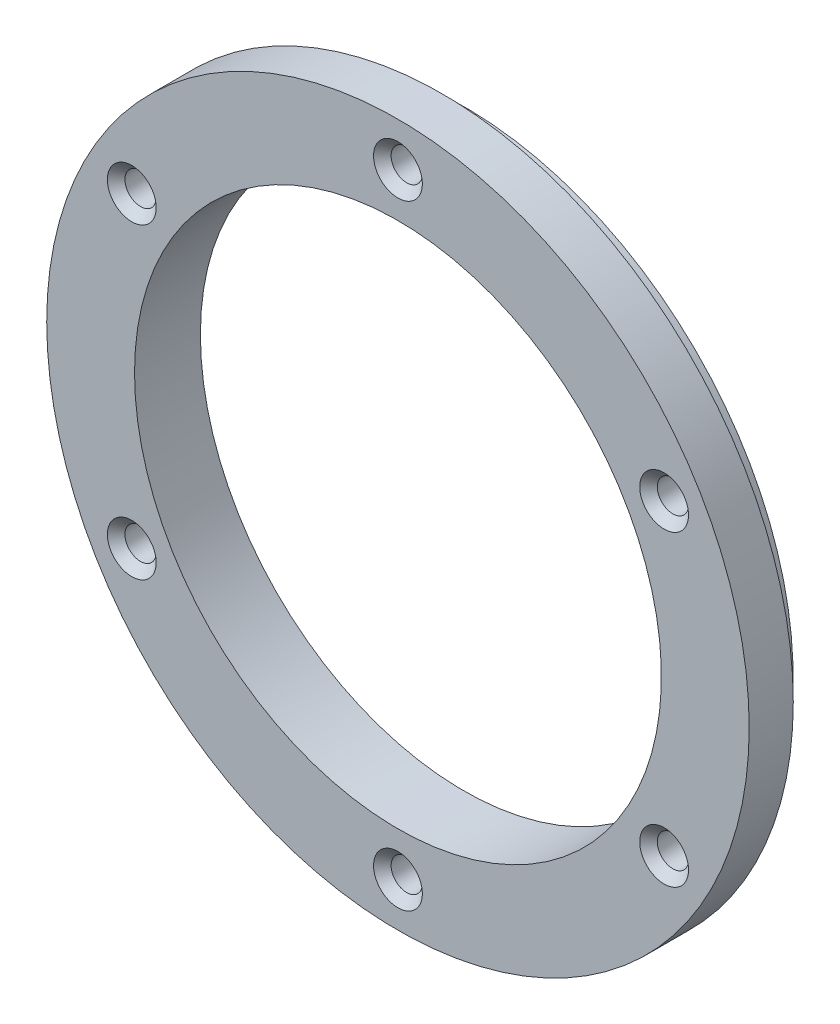
ISO-10303-21;
HEADER;
FILE_DESCRIPTION(('STEP AP214'),'2;1');
FILE_NAME('part.step','',(''),(''),'','','');
FILE_SCHEMA(('AUTOMOTIVE_DESIGN { 1 0 10303 214 1 1 1 1 }'));
ENDSEC;
DATA;
#1=APPLICATION_CONTEXT('core data for automotive mechanical design processes');
#2=APPLICATION_PROTOCOL_DEFINITION('international standard','automotive_design',2000,#1);
#3=PRODUCT_CONTEXT('',#1,'mechanical');
#4=PRODUCT('Part','Part','',(#3));
#5=PRODUCT_RELATED_PRODUCT_CATEGORY('part','',(#4));
#6=PRODUCT_DEFINITION_FORMATION('','',#4);
#7=PRODUCT_DEFINITION_CONTEXT('part definition',#1,'design');
#8=PRODUCT_DEFINITION('design','',#6,#7);
#9=PRODUCT_DEFINITION_SHAPE('','',#8);
#10=(LENGTH_UNIT() NAMED_UNIT(*) SI_UNIT(.MILLI.,.METRE.));
#11=(NAMED_UNIT(*) PLANE_ANGLE_UNIT() SI_UNIT($,.RADIAN.));
#12=(NAMED_UNIT(*) SI_UNIT($,.STERADIAN.) SOLID_ANGLE_UNIT());
#13=UNCERTAINTY_MEASURE_WITH_UNIT(LENGTH_MEASURE(1.E-05),#10,'distance_accuracy_value','');
#14=(GEOMETRIC_REPRESENTATION_CONTEXT(3) GLOBAL_UNCERTAINTY_ASSIGNED_CONTEXT((#13)) GLOBAL_UNIT_ASSIGNED_CONTEXT((#10,
#11,#12)) REPRESENTATION_CONTEXT('',''));
#15=CARTESIAN_POINT('',(0.,0.,0.));
#16=DIRECTION('',(0.,0.,1.));
#17=DIRECTION('',(1.,0.,0.));
#18=AXIS2_PLACEMENT_3D('',#15,#16,#17);
#19=CARTESIAN_POINT('',(0.,0.,0.));
#20=DIRECTION('',(0.,0.,1.));
#21=DIRECTION('',(1.,0.,0.));
#22=AXIS2_PLACEMENT_3D('',#19,#20,#21);
#23=PLANE('',#22);
#24=CARTESIAN_POINT('',(0.,0.,0.));
#25=DIRECTION('',(0.,0.,1.));
#26=DIRECTION('',(1.,0.,0.));
#27=AXIS2_PLACEMENT_3D('',#24,#25,#26);
#28=CIRCLE('',#27,19.05);
#29=CARTESIAN_POINT('',(-19.05,0.,0.));
#30=VERTEX_POINT('',#29);
#31=EDGE_CURVE('E48',#30,#30,#28,.T.);
#32=ORIENTED_EDGE('',*,*,#31,.T.);
#33=EDGE_LOOP('',(#32));
#34=FACE_BOUND('',#33,.T.);
#35=CARTESIAN_POINT('',(-19.247414599109,11.1125000000002,0.));
#36=DIRECTION('',(0.,0.,1.));
#37=DIRECTION('',(1.,0.,0.));
#38=AXIS2_PLACEMENT_3D('',#35,#36,#37);
#39=CIRCLE('',#38,1.13029999999999);
#40=CARTESIAN_POINT('',(-18.117114599109,11.1125000000002,0.));
#41=VERTEX_POINT('',#40);
#42=EDGE_CURVE('E52',#41,#41,#39,.T.);
#43=ORIENTED_EDGE('',*,*,#42,.T.);
#44=EDGE_LOOP('',(#43));
#45=FACE_BOUND('',#44,.T.);
#46=CARTESIAN_POINT('',(-19.2474145991087,-11.1125000000003,0.));
#47=DIRECTION('',(0.,0.,1.));
#48=DIRECTION('',(1.,0.,0.));
#49=AXIS2_PLACEMENT_3D('',#46,#47,#48);
#50=CIRCLE('',#49,1.13029999999999);
#51=CARTESIAN_POINT('',(-18.1171145991087,-11.1125000000003,0.));
#52=VERTEX_POINT('',#51);
#53=EDGE_CURVE('E56',#52,#52,#50,.T.);
#54=ORIENTED_EDGE('',*,*,#53,.T.);
#55=EDGE_LOOP('',(#54));
#56=FACE_BOUND('',#55,.T.);
#57=CARTESIAN_POINT('',(6.30260256199605E-13,-22.225,0.));
#58=DIRECTION('',(0.,0.,1.));
#59=DIRECTION('',(1.,0.,0.));
#60=AXIS2_PLACEMENT_3D('',#57,#58,#59);
#61=CIRCLE('',#60,1.13029999999999);
#62=CARTESIAN_POINT('',(1.13030000000062,-22.225,0.));
#63=VERTEX_POINT('',#62);
#64=EDGE_CURVE('E61',#63,#63,#61,.T.);
#65=ORIENTED_EDGE('',*,*,#64,.T.);
#66=EDGE_LOOP('',(#65));
#67=FACE_BOUND('',#66,.T.);
#68=CARTESIAN_POINT('',(19.2474145991096,-11.1124999999997,0.));
#69=DIRECTION('',(0.,0.,1.));
#70=DIRECTION('',(1.,0.,0.));
#71=AXIS2_PLACEMENT_3D('',#68,#69,#70);
#72=CIRCLE('',#71,1.13029999999999);
#73=CARTESIAN_POINT('',(20.3777145991096,-11.1124999999997,0.));
#74=VERTEX_POINT('',#73);
#75=EDGE_CURVE('E66',#74,#74,#72,.T.);
#76=ORIENTED_EDGE('',*,*,#75,.T.);
#77=EDGE_LOOP('',(#76));
#78=FACE_BOUND('',#77,.T.);
#79=CARTESIAN_POINT('',(19.2474145991092,11.1125,0.));
#80=DIRECTION('',(0.,0.,1.));
#81=DIRECTION('',(1.,0.,0.));
#82=AXIS2_PLACEMENT_3D('',#79,#80,#81);
#83=CIRCLE('',#82,1.13029999999999);
#84=CARTESIAN_POINT('',(20.3777145991092,11.1125,0.));
#85=VERTEX_POINT('',#84);
#86=EDGE_CURVE('E71',#85,#85,#83,.T.);
#87=ORIENTED_EDGE('',*,*,#86,.T.);
#88=EDGE_LOOP('',(#87));
#89=FACE_BOUND('',#88,.T.);
#90=CARTESIAN_POINT('',(0.,22.225,0.));
#91=DIRECTION('',(0.,0.,1.));
#92=DIRECTION('',(1.,0.,0.));
#93=AXIS2_PLACEMENT_3D('',#90,#91,#92);
#94=CIRCLE('',#93,1.13029999999999);
#95=CARTESIAN_POINT('',(1.13029999999999,22.225,0.));
#96=VERTEX_POINT('',#95);
#97=EDGE_CURVE('E75',#96,#96,#94,.T.);
#98=ORIENTED_EDGE('',*,*,#97,.T.);
#99=EDGE_LOOP('',(#98));
#100=FACE_BOUND('',#99,.T.);
#101=CARTESIAN_POINT('',(0.,0.,0.));
#102=DIRECTION('',(0.,0.,-1.));
#103=DIRECTION('',(-1.,0.,0.));
#104=AXIS2_PLACEMENT_3D('',#101,#102,#103);
#105=CIRCLE('',#104,23.8125);
#106=CARTESIAN_POINT('',(-23.8125,0.,0.));
#107=VERTEX_POINT('',#106);
#108=EDGE_CURVE('E149',#107,#107,#105,.T.);
#109=ORIENTED_EDGE('',*,*,#108,.T.);
#110=EDGE_LOOP('',(#109));
#111=FACE_BOUND('',#110,.T.);
#112=ADVANCED_FACE('F35',(#34,#45,#56,#67,#78,#89,#100,#111),#23,.F.);
#113=CARTESIAN_POINT('',(0.,0.,4.7625));
#114=DIRECTION('',(0.,0.,-1.));
#115=DIRECTION('',(-1.,0.,0.));
#116=AXIS2_PLACEMENT_3D('',#113,#114,#115);
#117=CYLINDRICAL_SURFACE('',#116,25.4);
#118=CARTESIAN_POINT('',(0.,0.,4.7625));
#119=DIRECTION('',(0.,0.,1.));
#120=DIRECTION('',(1.,0.,0.));
#121=AXIS2_PLACEMENT_3D('',#118,#119,#120);
#122=CIRCLE('',#121,25.4);
#123=CARTESIAN_POINT('',(-25.4,0.,4.7625));
#124=VERTEX_POINT('',#123);
#125=EDGE_CURVE('E11',#124,#124,#122,.T.);
#126=CARTESIAN_POINT('',(0.,0.,1.5748));
#127=DIRECTION('',(0.,0.,-1.));
#128=DIRECTION('',(-1.,0.,0.));
#129=AXIS2_PLACEMENT_3D('',#126,#127,#128);
#130=CIRCLE('',#129,25.4);
#131=CARTESIAN_POINT('',(-25.4,0.,1.5748));
#132=VERTEX_POINT('',#131);
#133=EDGE_CURVE('E39',#132,#132,#130,.T.);
#134=CARTESIAN_POINT('',(-25.4,0.,4.7625));
#135=CARTESIAN_POINT('',(-25.4,0.,4.72929479166667));
#136=CARTESIAN_POINT('',(-25.4,0.,4.69608958333333));
#137=CARTESIAN_POINT('',(-25.4,0.,4.62967916666667));
#138=CARTESIAN_POINT('',(-25.4,0.,4.59647395833333));
#139=CARTESIAN_POINT('',(-25.4,0.,4.53006354166667));
#140=CARTESIAN_POINT('',(-25.4,0.,4.49685833333333));
#141=CARTESIAN_POINT('',(-25.4,0.,4.43044791666667));
#142=CARTESIAN_POINT('',(-25.4,0.,4.39724270833333));
#143=CARTESIAN_POINT('',(-25.4,0.,4.33083229166667));
#144=CARTESIAN_POINT('',(-25.4,0.,4.29762708333333));
#145=CARTESIAN_POINT('',(-25.4,0.,4.23121666666667));
#146=CARTESIAN_POINT('',(-25.4,0.,4.19801145833333));
#147=CARTESIAN_POINT('',(-25.4,0.,4.13160104166667));
#148=CARTESIAN_POINT('',(-25.4,0.,4.09839583333333));
#149=CARTESIAN_POINT('',(-25.4,0.,4.03198541666667));
#150=CARTESIAN_POINT('',(-25.4,0.,3.99878020833333));
#151=CARTESIAN_POINT('',(-25.4,0.,3.93236979166667));
#152=CARTESIAN_POINT('',(-25.4,0.,3.89916458333333));
#153=CARTESIAN_POINT('',(-25.4,0.,3.83275416666667));
#154=CARTESIAN_POINT('',(-25.4,0.,3.79954895833333));
#155=CARTESIAN_POINT('',(-25.4,0.,3.73313854166667));
#156=CARTESIAN_POINT('',(-25.4,0.,3.69993333333333));
#157=CARTESIAN_POINT('',(-25.4,0.,3.63352291666667));
#158=CARTESIAN_POINT('',(-25.4,0.,3.60031770833333));
#159=CARTESIAN_POINT('',(-25.4,0.,3.53390729166667));
#160=CARTESIAN_POINT('',(-25.4,0.,3.50070208333333));
#161=CARTESIAN_POINT('',(-25.4,0.,3.43429166666667));
#162=CARTESIAN_POINT('',(-25.4,0.,3.40108645833333));
#163=CARTESIAN_POINT('',(-25.4,0.,3.33467604166667));
#164=CARTESIAN_POINT('',(-25.4,0.,3.30147083333333));
#165=CARTESIAN_POINT('',(-25.4,0.,3.23506041666667));
#166=CARTESIAN_POINT('',(-25.4,0.,3.20185520833333));
#167=CARTESIAN_POINT('',(-25.4,0.,3.13544479166667));
#168=CARTESIAN_POINT('',(-25.4,0.,3.10223958333333));
#169=CARTESIAN_POINT('',(-25.4,0.,3.03582916666667));
#170=CARTESIAN_POINT('',(-25.4,0.,3.00262395833333));
#171=CARTESIAN_POINT('',(-25.4,0.,2.93621354166667));
#172=CARTESIAN_POINT('',(-25.4,0.,2.90300833333333));
#173=CARTESIAN_POINT('',(-25.4,0.,2.83659791666667));
#174=CARTESIAN_POINT('',(-25.4,0.,2.80339270833333));
#175=CARTESIAN_POINT('',(-25.4,0.,2.73698229166667));
#176=CARTESIAN_POINT('',(-25.4,0.,2.70377708333333));
#177=CARTESIAN_POINT('',(-25.4,0.,2.63736666666667));
#178=CARTESIAN_POINT('',(-25.4,0.,2.60416145833333));
#179=CARTESIAN_POINT('',(-25.4,0.,2.53775104166667));
#180=CARTESIAN_POINT('',(-25.4,0.,2.50454583333333));
#181=CARTESIAN_POINT('',(-25.4,0.,2.43813541666667));
#182=CARTESIAN_POINT('',(-25.4,0.,2.40493020833333));
#183=CARTESIAN_POINT('',(-25.4,0.,2.33851979166667));
#184=CARTESIAN_POINT('',(-25.4,0.,2.30531458333333));
#185=CARTESIAN_POINT('',(-25.4,0.,2.23890416666667));
#186=CARTESIAN_POINT('',(-25.4,0.,2.20569895833333));
#187=CARTESIAN_POINT('',(-25.4,0.,2.13928854166667));
#188=CARTESIAN_POINT('',(-25.4,0.,2.10608333333333));
#189=CARTESIAN_POINT('',(-25.4,0.,2.03967291666667));
#190=CARTESIAN_POINT('',(-25.4,0.,2.00646770833333));
#191=CARTESIAN_POINT('',(-25.4,0.,1.94005729166667));
#192=CARTESIAN_POINT('',(-25.4,0.,1.90685208333333));
#193=CARTESIAN_POINT('',(-25.4,0.,1.84044166666667));
#194=CARTESIAN_POINT('',(-25.4,0.,1.80723645833333));
#195=CARTESIAN_POINT('',(-25.4,0.,1.74082604166667));
#196=CARTESIAN_POINT('',(-25.4,0.,1.70762083333333));
#197=CARTESIAN_POINT('',(-25.4,0.,1.64121041666667));
#198=CARTESIAN_POINT('',(-25.4,0.,1.60800520833333));
#199=CARTESIAN_POINT('',(-25.4,0.,1.5748));
#200=B_SPLINE_CURVE_WITH_KNOTS('',3,(#134,#135,#136,#137,#138,#139,#140,#141,#142,#143,#144,
#145,#146,#147,#148,#149,#150,#151,#152,#153,#154,#155,#156,#157,#158,#159,#160,#161,#162,#163,
#164,#165,#166,#167,#168,#169,#170,#171,#172,#173,#174,#175,#176,#177,#178,#179,#180,#181,#182,
#183,#184,#185,#186,#187,#188,#189,#190,#191,#192,#193,#194,#195,#196,#197,#198,#199),
.UNSPECIFIED.,.F.,.F.,(4,2,2,2,2,2,2,2,2,2,2,2,2,2,2,2,2,2,2,2,2,2,2,2,2,2,2,2,2,2,2,2,4),(0.,
0.0996156249999996,0.199231249999999,0.298846875,0.398462499999999,0.498078125,
0.597693749999999,0.697309375,0.796925,0.896540625,0.99615625,1.095771875,1.1953875,1.295003125,
1.39461875,1.494234375,1.59385,1.693465625,1.79308125,1.892696875,1.9923125,2.091928125,
2.19154375,2.291159375,2.390775,2.490390625,2.59000625,2.689621875,2.7892375,2.888853125,
2.98846875,3.088084375,3.1877),.UNSPECIFIED.);
#201=EDGE_CURVE('BSEAM37',#124,#132,#200,.T.);
#202=ORIENTED_EDGE('',*,*,#125,.F.);
#203=ORIENTED_EDGE('',*,*,#133,.F.);
#204=ORIENTED_EDGE('',*,*,#201,.T.);
#205=ORIENTED_EDGE('',*,*,#201,.F.);
#206=EDGE_LOOP('',(#202,#204,#203,#205));
#207=FACE_BOUND('',#206,.T.);
#208=ADVANCED_FACE('F37',(#207),#117,.T.);
#209=CARTESIAN_POINT('',(0.,0.,4.7625));
#210=DIRECTION('',(0.,0.,1.));
#211=DIRECTION('',(1.,0.,0.));
#212=AXIS2_PLACEMENT_3D('',#209,#210,#211);
#213=PLANE('',#212);
#214=CARTESIAN_POINT('',(0.,22.225,4.7625));
#215=DIRECTION('',(0.,0.,1.));
#216=DIRECTION('',(1.,0.,0.));
#217=AXIS2_PLACEMENT_3D('',#214,#215,#216);
#218=CIRCLE('',#217,1.7653);
#219=CARTESIAN_POINT('',(1.7653,22.225,4.7625));
#220=VERTEX_POINT('',#219);
#221=EDGE_CURVE('E84',#220,#220,#218,.T.);
#222=ORIENTED_EDGE('',*,*,#221,.F.);
#223=EDGE_LOOP('',(#222));
#224=FACE_BOUND('',#223,.T.);
#225=CARTESIAN_POINT('',(19.2474145991092,11.1125,4.7625));
#226=DIRECTION('',(0.,0.,1.));
#227=DIRECTION('',(1.,0.,0.));
#228=AXIS2_PLACEMENT_3D('',#225,#226,#227);
#229=CIRCLE('',#228,1.7653);
#230=CARTESIAN_POINT('',(21.0127145991092,11.1125,4.7625));
#231=VERTEX_POINT('',#230);
#232=EDGE_CURVE('E77',#231,#231,#229,.T.);
#233=ORIENTED_EDGE('',*,*,#232,.F.);
#234=EDGE_LOOP('',(#233));
#235=FACE_BOUND('',#234,.T.);
#236=CARTESIAN_POINT('',(19.2474145991096,-11.1124999999997,4.7625));
#237=DIRECTION('',(0.,0.,1.));
#238=DIRECTION('',(1.,0.,0.));
#239=AXIS2_PLACEMENT_3D('',#236,#237,#238);
#240=CIRCLE('',#239,1.7653);
#241=CARTESIAN_POINT('',(21.0127145991096,-11.1124999999997,4.7625));
#242=VERTEX_POINT('',#241);
#243=EDGE_CURVE('E73',#242,#242,#240,.T.);
#244=ORIENTED_EDGE('',*,*,#243,.F.);
#245=EDGE_LOOP('',(#244));
#246=FACE_BOUND('',#245,.T.);
#247=CARTESIAN_POINT('',(6.30260256199605E-13,-22.225,4.7625));
#248=DIRECTION('',(0.,0.,1.));
#249=DIRECTION('',(1.,0.,0.));
#250=AXIS2_PLACEMENT_3D('',#247,#248,#249);
#251=CIRCLE('',#250,1.7653);
#252=CARTESIAN_POINT('',(1.76530000000063,-22.225,4.7625));
#253=VERTEX_POINT('',#252);
#254=EDGE_CURVE('E69',#253,#253,#251,.T.);
#255=ORIENTED_EDGE('',*,*,#254,.F.);
#256=EDGE_LOOP('',(#255));
#257=FACE_BOUND('',#256,.T.);
#258=CARTESIAN_POINT('',(-19.2474145991087,-11.1125000000003,4.7625));
#259=DIRECTION('',(0.,0.,1.));
#260=DIRECTION('',(1.,0.,0.));
#261=AXIS2_PLACEMENT_3D('',#258,#259,#260);
#262=CIRCLE('',#261,1.7653);
#263=CARTESIAN_POINT('',(-17.4821145991087,-11.1125000000003,4.7625));
#264=VERTEX_POINT('',#263);
#265=EDGE_CURVE('E64',#264,#264,#262,.T.);
#266=ORIENTED_EDGE('',*,*,#265,.F.);
#267=EDGE_LOOP('',(#266));
#268=FACE_BOUND('',#267,.T.);
#269=CARTESIAN_POINT('',(-19.247414599109,11.1125000000002,4.7625));
#270=DIRECTION('',(0.,0.,1.));
#271=DIRECTION('',(1.,0.,0.));
#272=AXIS2_PLACEMENT_3D('',#269,#270,#271);
#273=CIRCLE('',#272,1.7653);
#274=CARTESIAN_POINT('',(-17.482114599109,11.1125000000002,4.7625));
#275=VERTEX_POINT('',#274);
#276=EDGE_CURVE('E59',#275,#275,#273,.T.);
#277=ORIENTED_EDGE('',*,*,#276,.F.);
#278=EDGE_LOOP('',(#277));
#279=FACE_BOUND('',#278,.T.);
#280=ORIENTED_EDGE('',*,*,#125,.T.);
#281=EDGE_LOOP('',(#280));
#282=FACE_BOUND('',#281,.T.);
#283=CARTESIAN_POINT('',(0.,0.,4.7625));
#284=DIRECTION('',(0.,0.,1.));
#285=DIRECTION('',(1.,0.,0.));
#286=AXIS2_PLACEMENT_3D('',#283,#284,#285);
#287=CIRCLE('',#286,19.05);
#288=CARTESIAN_POINT('',(-19.05,0.,4.7625));
#289=VERTEX_POINT('',#288);
#290=EDGE_CURVE('E43',#289,#289,#287,.T.);
#291=ORIENTED_EDGE('',*,*,#290,.F.);
#292=EDGE_LOOP('',(#291));
#293=FACE_BOUND('',#292,.T.);
#294=ADVANCED_FACE('F121',(#224,#235,#246,#257,#268,#279,#282,#293),#213,.T.);
#295=CARTESIAN_POINT('',(0.,0.,4.7625));
#296=DIRECTION('',(0.,0.,-1.));
#297=DIRECTION('',(-1.,0.,0.));
#298=AXIS2_PLACEMENT_3D('',#295,#296,#297);
#299=CYLINDRICAL_SURFACE('',#298,19.05);
#300=CARTESIAN_POINT('',(-19.05,0.,4.7625));
#301=CARTESIAN_POINT('',(-19.05,0.,4.712890625));
#302=CARTESIAN_POINT('',(-19.05,0.,4.66328125));
#303=CARTESIAN_POINT('',(-19.05,0.,4.5640625));
#304=CARTESIAN_POINT('',(-19.05,0.,4.514453125));
#305=CARTESIAN_POINT('',(-19.05,0.,4.415234375));
#306=CARTESIAN_POINT('',(-19.05,0.,4.365625));
#307=CARTESIAN_POINT('',(-19.05,0.,4.26640625));
#308=CARTESIAN_POINT('',(-19.05,0.,4.216796875));
#309=CARTESIAN_POINT('',(-19.05,0.,4.117578125));
#310=CARTESIAN_POINT('',(-19.05,0.,4.06796875));
#311=CARTESIAN_POINT('',(-19.05,0.,3.96875));
#312=CARTESIAN_POINT('',(-19.05,0.,3.919140625));
#313=CARTESIAN_POINT('',(-19.05,0.,3.819921875));
#314=CARTESIAN_POINT('',(-19.05,0.,3.7703125));
#315=CARTESIAN_POINT('',(-19.05,0.,3.67109375));
#316=CARTESIAN_POINT('',(-19.05,0.,3.621484375));
#317=CARTESIAN_POINT('',(-19.05,0.,3.522265625));
#318=CARTESIAN_POINT('',(-19.05,0.,3.47265625));
#319=CARTESIAN_POINT('',(-19.05,0.,3.3734375));
#320=CARTESIAN_POINT('',(-19.05,0.,3.323828125));
#321=CARTESIAN_POINT('',(-19.05,0.,3.224609375));
#322=CARTESIAN_POINT('',(-19.05,0.,3.175));
#323=CARTESIAN_POINT('',(-19.05,0.,3.07578125));
#324=CARTESIAN_POINT('',(-19.05,0.,3.026171875));
#325=CARTESIAN_POINT('',(-19.05,0.,2.926953125));
#326=CARTESIAN_POINT('',(-19.05,0.,2.87734375));
#327=CARTESIAN_POINT('',(-19.05,0.,2.778125));
#328=CARTESIAN_POINT('',(-19.05,0.,2.728515625));
#329=CARTESIAN_POINT('',(-19.05,0.,2.629296875));
#330=CARTESIAN_POINT('',(-19.05,0.,2.5796875));
#331=CARTESIAN_POINT('',(-19.05,0.,2.48046875));
#332=CARTESIAN_POINT('',(-19.05,0.,2.430859375));
#333=CARTESIAN_POINT('',(-19.05,0.,2.331640625));
#334=CARTESIAN_POINT('',(-19.05,0.,2.28203125));
#335=CARTESIAN_POINT('',(-19.05,0.,2.1828125));
#336=CARTESIAN_POINT('',(-19.05,0.,2.133203125));
#337=CARTESIAN_POINT('',(-19.05,0.,2.033984375));
#338=CARTESIAN_POINT('',(-19.05,0.,1.984375));
#339=CARTESIAN_POINT('',(-19.05,0.,1.88515625));
#340=CARTESIAN_POINT('',(-19.05,0.,1.835546875));
#341=CARTESIAN_POINT('',(-19.05,0.,1.736328125));
#342=CARTESIAN_POINT('',(-19.05,0.,1.68671875));
#343=CARTESIAN_POINT('',(-19.05,0.,1.5875));
#344=CARTESIAN_POINT('',(-19.05,0.,1.537890625));
#345=CARTESIAN_POINT('',(-19.05,0.,1.438671875));
#346=CARTESIAN_POINT('',(-19.05,0.,1.3890625));
#347=CARTESIAN_POINT('',(-19.05,0.,1.28984375));
#348=CARTESIAN_POINT('',(-19.05,0.,1.240234375));
#349=CARTESIAN_POINT('',(-19.05,0.,1.141015625));
#350=CARTESIAN_POINT('',(-19.05,0.,1.09140625));
#351=CARTESIAN_POINT('',(-19.05,0.,0.992187499999999));
#352=CARTESIAN_POINT('',(-19.05,0.,0.942578124999999));
#353=CARTESIAN_POINT('',(-19.05,0.,0.843359375));
#354=CARTESIAN_POINT('',(-19.05,0.,0.79375));
#355=CARTESIAN_POINT('',(-19.05,0.,0.69453125));
#356=CARTESIAN_POINT('',(-19.05,0.,0.644921875));
#357=CARTESIAN_POINT('',(-19.05,0.,0.545703125));
#358=CARTESIAN_POINT('',(-19.05,0.,0.49609375));
#359=CARTESIAN_POINT('',(-19.05,0.,0.396875));
#360=CARTESIAN_POINT('',(-19.05,0.,0.347265625));
#361=CARTESIAN_POINT('',(-19.05,0.,0.248046875));
#362=CARTESIAN_POINT('',(-19.05,0.,0.1984375));
#363=CARTESIAN_POINT('',(-19.05,0.,0.09921875));
#364=CARTESIAN_POINT('',(-19.05,0.,0.049609375));
#365=CARTESIAN_POINT('',(-19.05,0.,0.));
#366=B_SPLINE_CURVE_WITH_KNOTS('',3,(#300,#301,#302,#303,#304,#305,#306,#307,#308,#309,#310,
#311,#312,#313,#314,#315,#316,#317,#318,#319,#320,#321,#322,#323,#324,#325,#326,#327,#328,#329,
#330,#331,#332,#333,#334,#335,#336,#337,#338,#339,#340,#341,#342,#343,#344,#345,#346,#347,#348,
#349,#350,#351,#352,#353,#354,#355,#356,#357,#358,#359,#360,#361,#362,#363,#364,#365),
.UNSPECIFIED.,.F.,.F.,(4,2,2,2,2,2,2,2,2,2,2,2,2,2,2,2,2,2,2,2,2,2,2,2,2,2,2,2,2,2,2,2,4),(0.,
0.148828125,0.29765625,0.446484375,0.5953125,0.744140625,0.892968750000001,1.041796875,1.190625,
1.339453125,1.48828125,1.637109375,1.7859375,1.934765625,2.08359375,2.232421875,2.38125,
2.530078125,2.67890625,2.827734375,2.9765625,3.125390625,3.27421875,3.423046875,3.571875,
3.720703125,3.86953125,4.018359375,4.1671875,4.316015625,4.46484375,4.613671875,4.7625),.UNSPECIFIED.);
#367=EDGE_CURVE('BSEAM123',#289,#30,#366,.T.);
#368=ORIENTED_EDGE('',*,*,#290,.T.);
#369=ORIENTED_EDGE('',*,*,#31,.F.);
#370=ORIENTED_EDGE('',*,*,#367,.T.);
#371=ORIENTED_EDGE('',*,*,#367,.F.);
#372=EDGE_LOOP('',(#368,#370,#369,#371));
#373=FACE_BOUND('',#372,.T.);
#374=ADVANCED_FACE('F123',(#373),#299,.F.);
#375=CARTESIAN_POINT('',(-19.247414599109,11.1125000000002,4.7625));
#376=DIRECTION('',(0.,0.,1.));
#377=DIRECTION('',(1.,0.,0.));
#378=AXIS2_PLACEMENT_3D('',#375,#376,#377);
#379=CYLINDRICAL_SURFACE('',#378,1.13029999999999);
#380=CARTESIAN_POINT('',(-19.247414599109,11.1125000000002,4.1275));
#381=DIRECTION('',(0.,0.,1.));
#382=DIRECTION('',(1.,0.,0.));
#383=AXIS2_PLACEMENT_3D('',#380,#381,#382);
#384=CIRCLE('',#383,1.1303);
#385=CARTESIAN_POINT('',(-18.117114599109,11.1125000000002,4.1275));
#386=VERTEX_POINT('',#385);
#387=EDGE_CURVE('E55',#386,#386,#384,.T.);
#388=ORIENTED_EDGE('',*,*,#387,.T.);
#389=EDGE_LOOP('',(#388));
#390=FACE_BOUND('',#389,.T.);
#391=ORIENTED_EDGE('',*,*,#42,.F.);
#392=EDGE_LOOP('',(#391));
#393=FACE_BOUND('',#392,.T.);
#394=ADVANCED_FACE('F111',(#390,#393),#379,.F.);
#395=CARTESIAN_POINT('',(-19.247414599109,11.1125000000002,4.7625));
#396=DIRECTION('',(0.,0.,1.));
#397=DIRECTION('',(1.,0.,0.));
#398=AXIS2_PLACEMENT_3D('',#395,#396,#397);
#399=CONICAL_SURFACE('',#398,1.7653,0.785398163397446);
#400=ORIENTED_EDGE('',*,*,#387,.F.);
#401=EDGE_LOOP('',(#400));
#402=FACE_BOUND('',#401,.T.);
#403=ORIENTED_EDGE('',*,*,#276,.T.);
#404=EDGE_LOOP('',(#403));
#405=FACE_BOUND('',#404,.T.);
#406=ADVANCED_FACE('F114',(#402,#405),#399,.F.);
#407=CARTESIAN_POINT('',(-19.2474145991087,-11.1125000000003,4.7625));
#408=DIRECTION('',(0.,0.,1.));
#409=DIRECTION('',(1.,0.,0.));
#410=AXIS2_PLACEMENT_3D('',#407,#408,#409);
#411=CYLINDRICAL_SURFACE('',#410,1.13029999999999);
#412=CARTESIAN_POINT('',(-19.2474145991087,-11.1125000000003,4.1275));
#413=DIRECTION('',(0.,0.,1.));
#414=DIRECTION('',(1.,0.,0.));
#415=AXIS2_PLACEMENT_3D('',#412,#413,#414);
#416=CIRCLE('',#415,1.1303);
#417=CARTESIAN_POINT('',(-18.1171145991087,-11.1125000000003,4.1275));
#418=VERTEX_POINT('',#417);
#419=EDGE_CURVE('E60',#418,#418,#416,.T.);
#420=ORIENTED_EDGE('',*,*,#419,.T.);
#421=EDGE_LOOP('',(#420));
#422=FACE_BOUND('',#421,.T.);
#423=ORIENTED_EDGE('',*,*,#53,.F.);
#424=EDGE_LOOP('',(#423));
#425=FACE_BOUND('',#424,.T.);
#426=ADVANCED_FACE('F117',(#422,#425),#411,.F.);
#427=CARTESIAN_POINT('',(-19.2474145991087,-11.1125000000003,4.7625));
#428=DIRECTION('',(0.,0.,1.));
#429=DIRECTION('',(1.,0.,0.));
#430=AXIS2_PLACEMENT_3D('',#427,#428,#429);
#431=CONICAL_SURFACE('',#430,1.7653,0.785398163397449);
#432=ORIENTED_EDGE('',*,*,#419,.F.);
#433=EDGE_LOOP('',(#432));
#434=FACE_BOUND('',#433,.T.);
#435=ORIENTED_EDGE('',*,*,#265,.T.);
#436=EDGE_LOOP('',(#435));
#437=FACE_BOUND('',#436,.T.);
#438=ADVANCED_FACE('F194',(#434,#437),#431,.F.);
#439=CARTESIAN_POINT('',(6.30260256199605E-13,-22.225,4.7625));
#440=DIRECTION('',(0.,0.,1.));
#441=DIRECTION('',(1.,0.,0.));
#442=AXIS2_PLACEMENT_3D('',#439,#440,#441);
#443=CYLINDRICAL_SURFACE('',#442,1.13029999999999);
#444=CARTESIAN_POINT('',(6.30260256199605E-13,-22.225,4.1275));
#445=DIRECTION('',(0.,0.,1.));
#446=DIRECTION('',(1.,0.,0.));
#447=AXIS2_PLACEMENT_3D('',#444,#445,#446);
#448=CIRCLE('',#447,1.1303);
#449=CARTESIAN_POINT('',(1.13030000000063,-22.225,4.1275));
#450=VERTEX_POINT('',#449);
#451=EDGE_CURVE('E65',#450,#450,#448,.T.);
#452=ORIENTED_EDGE('',*,*,#451,.T.);
#453=EDGE_LOOP('',(#452));
#454=FACE_BOUND('',#453,.T.);
#455=ORIENTED_EDGE('',*,*,#64,.F.);
#456=EDGE_LOOP('',(#455));
#457=FACE_BOUND('',#456,.T.);
#458=ADVANCED_FACE('F203',(#454,#457),#443,.F.);
#459=CARTESIAN_POINT('',(6.30260256199605E-13,-22.225,4.7625));
#460=DIRECTION('',(0.,0.,1.));
#461=DIRECTION('',(1.,0.,0.));
#462=AXIS2_PLACEMENT_3D('',#459,#460,#461);
#463=CONICAL_SURFACE('',#462,1.7653,0.785398163397448);
#464=ORIENTED_EDGE('',*,*,#451,.F.);
#465=EDGE_LOOP('',(#464));
#466=FACE_BOUND('',#465,.T.);
#467=ORIENTED_EDGE('',*,*,#254,.T.);
#468=EDGE_LOOP('',(#467));
#469=FACE_BOUND('',#468,.T.);
#470=ADVANCED_FACE('F211',(#466,#469),#463,.F.);
#471=CARTESIAN_POINT('',(19.2474145991096,-11.1124999999997,4.7625));
#472=DIRECTION('',(0.,0.,1.));
#473=DIRECTION('',(1.,0.,0.));
#474=AXIS2_PLACEMENT_3D('',#471,#472,#473);
#475=CYLINDRICAL_SURFACE('',#474,1.13029999999999);
#476=CARTESIAN_POINT('',(19.2474145991096,-11.1124999999997,4.1275));
#477=DIRECTION('',(0.,0.,1.));
#478=DIRECTION('',(1.,0.,0.));
#479=AXIS2_PLACEMENT_3D('',#476,#477,#478);
#480=CIRCLE('',#479,1.1303);
#481=CARTESIAN_POINT('',(20.3777145991096,-11.1124999999997,4.1275));
#482=VERTEX_POINT('',#481);
#483=EDGE_CURVE('E70',#482,#482,#480,.T.);
#484=ORIENTED_EDGE('',*,*,#483,.T.);
#485=EDGE_LOOP('',(#484));
#486=FACE_BOUND('',#485,.T.);
#487=ORIENTED_EDGE('',*,*,#75,.F.);
#488=EDGE_LOOP('',(#487));
#489=FACE_BOUND('',#488,.T.);
#490=ADVANCED_FACE('F220',(#486,#489),#475,.F.);
#491=CARTESIAN_POINT('',(19.2474145991096,-11.1124999999997,4.7625));
#492=DIRECTION('',(0.,0.,1.));
#493=DIRECTION('',(1.,0.,0.));
#494=AXIS2_PLACEMENT_3D('',#491,#492,#493);
#495=CONICAL_SURFACE('',#494,1.7653,0.785398163397449);
#496=ORIENTED_EDGE('',*,*,#483,.F.);
#497=EDGE_LOOP('',(#496));
#498=FACE_BOUND('',#497,.T.);
#499=ORIENTED_EDGE('',*,*,#243,.T.);
#500=EDGE_LOOP('',(#499));
#501=FACE_BOUND('',#500,.T.);
#502=ADVANCED_FACE('F229',(#498,#501),#495,.F.);
#503=CARTESIAN_POINT('',(19.2474145991092,11.1125,4.7625));
#504=DIRECTION('',(0.,0.,1.));
#505=DIRECTION('',(1.,0.,0.));
#506=AXIS2_PLACEMENT_3D('',#503,#504,#505);
#507=CYLINDRICAL_SURFACE('',#506,1.13029999999999);
#508=CARTESIAN_POINT('',(19.2474145991092,11.1125,4.1275));
#509=DIRECTION('',(0.,0.,1.));
#510=DIRECTION('',(1.,0.,0.));
#511=AXIS2_PLACEMENT_3D('',#508,#509,#510);
#512=CIRCLE('',#511,1.1303);
#513=CARTESIAN_POINT('',(20.3777145991092,11.1125,4.1275));
#514=VERTEX_POINT('',#513);
#515=EDGE_CURVE('E74',#514,#514,#512,.T.);
#516=ORIENTED_EDGE('',*,*,#515,.T.);
#517=EDGE_LOOP('',(#516));
#518=FACE_BOUND('',#517,.T.);
#519=ORIENTED_EDGE('',*,*,#86,.F.);
#520=EDGE_LOOP('',(#519));
#521=FACE_BOUND('',#520,.T.);
#522=ADVANCED_FACE('F238',(#518,#521),#507,.F.);
#523=CARTESIAN_POINT('',(19.2474145991092,11.1125,4.7625));
#524=DIRECTION('',(0.,0.,1.));
#525=DIRECTION('',(1.,0.,0.));
#526=AXIS2_PLACEMENT_3D('',#523,#524,#525);
#527=CONICAL_SURFACE('',#526,1.7653,0.785398163397446);
#528=ORIENTED_EDGE('',*,*,#515,.F.);
#529=EDGE_LOOP('',(#528));
#530=FACE_BOUND('',#529,.T.);
#531=ORIENTED_EDGE('',*,*,#232,.T.);
#532=EDGE_LOOP('',(#531));
#533=FACE_BOUND('',#532,.T.);
#534=ADVANCED_FACE('F246',(#530,#533),#527,.F.);
#535=CARTESIAN_POINT('',(0.,22.225,4.7625));
#536=DIRECTION('',(0.,0.,1.));
#537=DIRECTION('',(1.,0.,0.));
#538=AXIS2_PLACEMENT_3D('',#535,#536,#537);
#539=CYLINDRICAL_SURFACE('',#538,1.13029999999999);
#540=CARTESIAN_POINT('',(0.,22.225,4.1275));
#541=DIRECTION('',(0.,0.,1.));
#542=DIRECTION('',(1.,0.,0.));
#543=AXIS2_PLACEMENT_3D('',#540,#541,#542);
#544=CIRCLE('',#543,1.1303);
#545=CARTESIAN_POINT('',(1.1303,22.225,4.1275));
#546=VERTEX_POINT('',#545);
#547=EDGE_CURVE('E78',#546,#546,#544,.T.);
#548=ORIENTED_EDGE('',*,*,#547,.T.);
#549=EDGE_LOOP('',(#548));
#550=FACE_BOUND('',#549,.T.);
#551=ORIENTED_EDGE('',*,*,#97,.F.);
#552=EDGE_LOOP('',(#551));
#553=FACE_BOUND('',#552,.T.);
#554=ADVANCED_FACE('F254',(#550,#553),#539,.F.);
#555=CARTESIAN_POINT('',(0.,22.225,4.7625));
#556=DIRECTION('',(0.,0.,1.));
#557=DIRECTION('',(1.,0.,0.));
#558=AXIS2_PLACEMENT_3D('',#555,#556,#557);
#559=CONICAL_SURFACE('',#558,1.7653,0.785398163397448);
#560=ORIENTED_EDGE('',*,*,#547,.F.);
#561=EDGE_LOOP('',(#560));
#562=FACE_BOUND('',#561,.T.);
#563=ORIENTED_EDGE('',*,*,#221,.T.);
#564=EDGE_LOOP('',(#563));
#565=FACE_BOUND('',#564,.T.);
#566=ADVANCED_FACE('F262',(#562,#565),#559,.F.);
#567=CARTESIAN_POINT('',(0.,0.,1.5748));
#568=DIRECTION('',(0.,0.,-1.));
#569=DIRECTION('',(-1.,0.,0.));
#570=AXIS2_PLACEMENT_3D('',#567,#568,#569);
#571=PLANE('',#570);
#572=CARTESIAN_POINT('',(0.,0.,1.5748));
#573=DIRECTION('',(0.,0.,-1.));
#574=DIRECTION('',(-1.,0.,0.));
#575=AXIS2_PLACEMENT_3D('',#572,#573,#574);
#576=CIRCLE('',#575,23.8125);
#577=CARTESIAN_POINT('',(-23.8125,0.,1.5748));
#578=VERTEX_POINT('',#577);
#579=EDGE_CURVE('E151',#578,#578,#576,.T.);
#580=ORIENTED_EDGE('',*,*,#579,.F.);
#581=EDGE_LOOP('',(#580));
#582=FACE_BOUND('',#581,.T.);
#583=ORIENTED_EDGE('',*,*,#133,.T.);
#584=EDGE_LOOP('',(#583));
#585=FACE_BOUND('',#584,.T.);
#586=ADVANCED_FACE('F159',(#582,#585),#571,.T.);
#587=CARTESIAN_POINT('',(0.,0.,1.5748));
#588=DIRECTION('',(0.,0.,-1.));
#589=DIRECTION('',(-1.,0.,0.));
#590=AXIS2_PLACEMENT_3D('',#587,#588,#589);
#591=CYLINDRICAL_SURFACE('',#590,23.8125);
#592=ORIENTED_EDGE('',*,*,#579,.T.);
#593=EDGE_LOOP('',(#592));
#594=FACE_BOUND('',#593,.T.);
#595=ORIENTED_EDGE('',*,*,#108,.F.);
#596=EDGE_LOOP('',(#595));
#597=FACE_BOUND('',#596,.T.);
#598=ADVANCED_FACE('F275',(#594,#597),#591,.T.);
#599=CLOSED_SHELL('',(#112,#208,#294,#374,#394,#406,#426,#438,#458,#470,#490,#502,#522,#534,
#554,#566,#586,#598));
#600=MANIFOLD_SOLID_BREP('B2',#599);
#601=ADVANCED_BREP_SHAPE_REPRESENTATION('',(#18,#600),#14);
#602=SHAPE_DEFINITION_REPRESENTATION(#9,#601);
ENDSEC;
END-ISO-10303-21;
